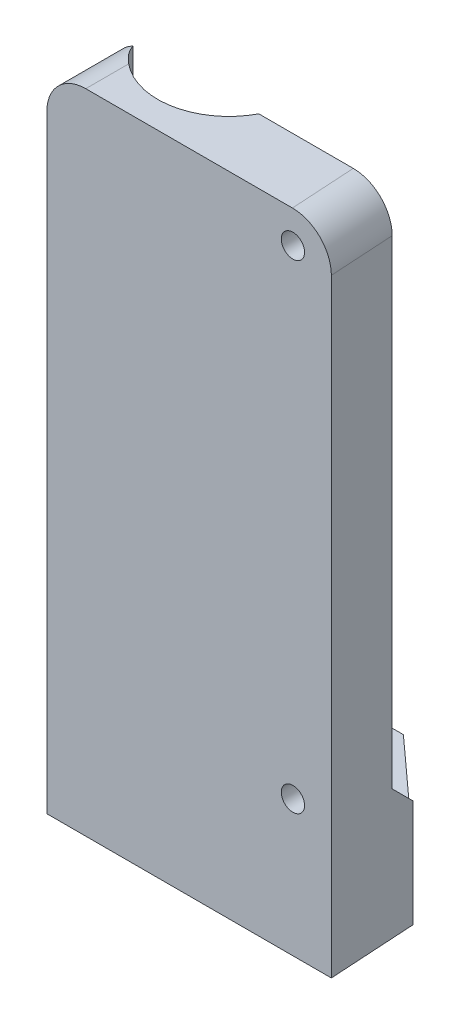
ISO-10303-21;
HEADER;
FILE_DESCRIPTION(('STEP AP214'),'2;1');
FILE_NAME('part.step','',(''),(''),'','','');
FILE_SCHEMA(('AUTOMOTIVE_DESIGN { 1 0 10303 214 1 1 1 1 }'));
ENDSEC;
DATA;
#1=APPLICATION_CONTEXT('core data for automotive mechanical design processes');
#2=APPLICATION_PROTOCOL_DEFINITION('international standard','automotive_design',2000,#1);
#3=PRODUCT_CONTEXT('',#1,'mechanical');
#4=PRODUCT('Part','Part','',(#3));
#5=PRODUCT_RELATED_PRODUCT_CATEGORY('part','',(#4));
#6=PRODUCT_DEFINITION_FORMATION('','',#4);
#7=PRODUCT_DEFINITION_CONTEXT('part definition',#1,'design');
#8=PRODUCT_DEFINITION('design','',#6,#7);
#9=PRODUCT_DEFINITION_SHAPE('','',#8);
#10=(LENGTH_UNIT() NAMED_UNIT(*) SI_UNIT(.MILLI.,.METRE.));
#11=(NAMED_UNIT(*) PLANE_ANGLE_UNIT() SI_UNIT($,.RADIAN.));
#12=(NAMED_UNIT(*) SI_UNIT($,.STERADIAN.) SOLID_ANGLE_UNIT());
#13=UNCERTAINTY_MEASURE_WITH_UNIT(LENGTH_MEASURE(1.E-05),#10,'distance_accuracy_value','');
#14=(GEOMETRIC_REPRESENTATION_CONTEXT(3) GLOBAL_UNCERTAINTY_ASSIGNED_CONTEXT((#13)) GLOBAL_UNIT_ASSIGNED_CONTEXT((#10,
#11,#12)) REPRESENTATION_CONTEXT('',''));
#15=CARTESIAN_POINT('',(0.,0.,0.));
#16=DIRECTION('',(0.,0.,1.));
#17=DIRECTION('',(1.,0.,0.));
#18=AXIS2_PLACEMENT_3D('',#15,#16,#17);
#19=CARTESIAN_POINT('',(-22.4690156650757,50.,7.56));
#20=DIRECTION('',(0.,0.,-1.));
#21=DIRECTION('',(-1.,0.,0.));
#22=AXIS2_PLACEMENT_3D('',#19,#20,#21);
#23=PLANE('',#22);
#24=CARTESIAN_POINT('',(12.5,47.5,7.56));
#25=DIRECTION('',(0.,0.,1.));
#26=DIRECTION('',(1.,0.,0.));
#27=AXIS2_PLACEMENT_3D('',#24,#25,#26);
#28=CIRCLE('',#27,0.9);
#29=CARTESIAN_POINT('',(13.4,47.5,7.56));
#30=VERTEX_POINT('',#29);
#31=EDGE_CURVE('E175',#30,#30,#28,.T.);
#32=ORIENTED_EDGE('',*,*,#31,.F.);
#33=EDGE_LOOP('',(#32));
#34=FACE_BOUND('',#33,.T.);
#35=CARTESIAN_POINT('',(12.5,10.5,7.56));
#36=DIRECTION('',(0.,0.,1.));
#37=DIRECTION('',(1.,0.,0.));
#38=AXIS2_PLACEMENT_3D('',#35,#36,#37);
#39=CIRCLE('',#38,0.9);
#40=CARTESIAN_POINT('',(13.4,10.5,7.56));
#41=VERTEX_POINT('',#40);
#42=EDGE_CURVE('E358',#41,#41,#39,.T.);
#43=ORIENTED_EDGE('',*,*,#42,.F.);
#44=EDGE_LOOP('',(#43));
#45=FACE_BOUND('',#44,.T.);
#46=DIRECTION('',(0.,1.,0.));
#47=VECTOR('',#46,1.);
#48=CARTESIAN_POINT('',(15.4690156650757,50.,7.56));
#49=LINE('',#48,#47);
#50=CARTESIAN_POINT('',(15.4690156650757,0.,7.56));
#51=VERTEX_POINT('',#50);
#52=CARTESIAN_POINT('',(15.4690156650757,47.,7.56));
#53=VERTEX_POINT('',#52);
#54=EDGE_CURVE('E246',#51,#53,#49,.T.);
#55=ORIENTED_EDGE('',*,*,#54,.T.);
#56=CARTESIAN_POINT('',(12.4635531063731,47.,7.56));
#57=DIRECTION('',(0.,0.,-1.));
#58=DIRECTION('',(-1.,0.,0.));
#59=AXIS2_PLACEMENT_3D('',#56,#57,#58);
#60=ELLIPSE('',#59,3.00546255870263,3.);
#61=CARTESIAN_POINT('',(12.4635531063731,50.,7.56));
#62=VERTEX_POINT('',#61);
#63=EDGE_CURVE('E234',#53,#62,#60,.F.);
#64=ORIENTED_EDGE('',*,*,#63,.T.);
#65=DIRECTION('',(1.,0.,0.));
#66=VECTOR('',#65,1.);
#67=CARTESIAN_POINT('',(-22.4690156650757,50.,7.56));
#68=LINE('',#67,#66);
#69=CARTESIAN_POINT('',(-3.5,50.,7.56));
#70=VERTEX_POINT('',#69);
#71=EDGE_CURVE('E244',#70,#62,#68,.T.);
#72=ORIENTED_EDGE('',*,*,#71,.F.);
#73=CARTESIAN_POINT('',(-3.5,47.,7.56));
#74=DIRECTION('',(0.,0.,-1.));
#75=DIRECTION('',(-1.,0.,0.));
#76=AXIS2_PLACEMENT_3D('',#73,#74,#75);
#77=CIRCLE('',#76,3.);
#78=CARTESIAN_POINT('',(-6.5,47.,7.56));
#79=VERTEX_POINT('',#78);
#80=EDGE_CURVE('E231',#70,#79,#77,.F.);
#81=ORIENTED_EDGE('',*,*,#80,.T.);
#82=DIRECTION('',(0.,1.,0.));
#83=VECTOR('',#82,1.);
#84=CARTESIAN_POINT('',(-6.5,50.,7.56));
#85=LINE('',#84,#83);
#86=CARTESIAN_POINT('',(-6.5,0.,7.56));
#87=VERTEX_POINT('',#86);
#88=EDGE_CURVE('E319',#87,#79,#85,.T.);
#89=ORIENTED_EDGE('',*,*,#88,.F.);
#90=DIRECTION('',(1.,0.,0.));
#91=VECTOR('',#90,1.);
#92=CARTESIAN_POINT('',(-22.4690156650757,0.,7.56));
#93=LINE('',#92,#91);
#94=EDGE_CURVE('E298',#87,#51,#93,.T.);
#95=ORIENTED_EDGE('',*,*,#94,.T.);
#96=EDGE_LOOP('',(#55,#64,#72,#81,#89,#95));
#97=FACE_BOUND('',#96,.T.);
#98=ADVANCED_FACE('F40',(#34,#45,#97),#23,.F.);
#99=CARTESIAN_POINT('',(5.32075950932338,50.,-8.));
#100=DIRECTION('',(-0.671979137980559,0.,0.740570076440376));
#101=DIRECTION('',(0.740570076440376,0.,0.671979137980559));
#102=AXIS2_PLACEMENT_3D('',#99,#100,#101);
#103=PLANE('',#102);
#104=DIRECTION('',(0.,-1.,0.));
#105=VECTOR('',#104,1.);
#106=CARTESIAN_POINT('',(6.97386903590619,50.,-6.5));
#107=LINE('',#106,#105);
#108=CARTESIAN_POINT('',(6.97386903590619,5.,-6.5));
#109=VERTEX_POINT('',#108);
#110=CARTESIAN_POINT('',(6.97386903590619,0.,-6.5));
#111=VERTEX_POINT('',#110);
#112=EDGE_CURVE('E313',#109,#111,#107,.T.);
#113=ORIENTED_EDGE('',*,*,#112,.F.);
#114=DIRECTION('',(0.740570076440376,0.,0.671979137980559));
#115=VECTOR('',#114,1.);
#116=CARTESIAN_POINT('',(5.32075950932338,5.,-8.));
#117=LINE('',#116,#115);
#118=CARTESIAN_POINT('',(11.4482854878569,5.,-2.44000000000004));
#119=VERTEX_POINT('',#118);
#120=EDGE_CURVE('E267',#109,#119,#117,.T.);
#121=ORIENTED_EDGE('',*,*,#120,.T.);
#122=DIRECTION('',(-0.614680262385864,-0.557749125966702,-0.557749125966707));
#123=VECTOR('',#122,1.);
#124=CARTESIAN_POINT('',(22.6546173963513,15.1684114648404,7.7284114648404));
#125=LINE('',#124,#123);
#126=CARTESIAN_POINT('',(15.0633149006719,8.2802086201944,0.840208620194387));
#127=VERTEX_POINT('',#126);
#128=EDGE_CURVE('E195',#119,#127,#125,.F.);
#129=ORIENTED_EDGE('',*,*,#128,.T.);
#130=DIRECTION('',(0.,-1.,0.));
#131=VECTOR('',#130,1.);
#132=CARTESIAN_POINT('',(15.0633149006719,50.,0.840208620194387));
#133=LINE('',#132,#131);
#134=CARTESIAN_POINT('',(15.0633149006719,0.,0.840208620194387));
#135=VERTEX_POINT('',#134);
#136=EDGE_CURVE('E256',#127,#135,#133,.T.);
#137=ORIENTED_EDGE('',*,*,#136,.T.);
#138=DIRECTION('',(-0.740570076440376,0.,-0.671979137980559));
#139=VECTOR('',#138,1.);
#140=CARTESIAN_POINT('',(5.32075950932338,0.,-8.));
#141=LINE('',#140,#139);
#142=EDGE_CURVE('E257',#135,#111,#141,.T.);
#143=ORIENTED_EDGE('',*,*,#142,.T.);
#144=EDGE_LOOP('',(#113,#121,#129,#137,#143));
#145=FACE_BOUND('',#144,.T.);
#146=ADVANCED_FACE('F371',(#145),#103,.F.);
#147=CARTESIAN_POINT('',(0.,50.,0.));
#148=DIRECTION('',(0.,-1.,0.));
#149=DIRECTION('',(0.,0.,-1.));
#150=AXIS2_PLACEMENT_3D('',#147,#148,#149);
#151=PLANE('',#150);
#152=ORIENTED_EDGE('',*,*,#71,.T.);
#153=DIRECTION('',(0.0602642794633902,0.,0.998182456578334));
#154=VECTOR('',#153,1.);
#155=CARTESIAN_POINT('',(12.1725982360834,50.,2.74079283839017));
#156=LINE('',#155,#154);
#157=CARTESIAN_POINT('',(12.1616830471157,50.,2.56));
#158=VERTEX_POINT('',#157);
#159=EDGE_CURVE('E221',#62,#158,#156,.F.);
#160=ORIENTED_EDGE('',*,*,#159,.T.);
#161=DIRECTION('',(1.,0.,0.));
#162=VECTOR('',#161,1.);
#163=CARTESIAN_POINT('',(4.86789482219984,50.,2.56));
#164=LINE('',#163,#162);
#165=CARTESIAN_POINT('',(4.86789482219984,50.,2.56));
#166=VERTEX_POINT('',#165);
#167=EDGE_CURVE('E217',#166,#158,#164,.T.);
#168=ORIENTED_EDGE('',*,*,#167,.F.);
#169=CARTESIAN_POINT('',(0.,50.,0.));
#170=DIRECTION('',(0.,1.,0.));
#171=DIRECTION('',(0.,0.,1.));
#172=AXIS2_PLACEMENT_3D('',#169,#170,#171);
#173=CIRCLE('',#172,5.5);
#174=CARTESIAN_POINT('',(-3.5,50.,4.24264068711928));
#175=VERTEX_POINT('',#174);
#176=EDGE_CURVE('E288',#175,#166,#173,.T.);
#177=ORIENTED_EDGE('',*,*,#176,.F.);
#178=DIRECTION('',(0.,0.,1.));
#179=VECTOR('',#178,1.);
#180=CARTESIAN_POINT('',(-3.5,50.,7.56));
#181=LINE('',#180,#179);
#182=EDGE_CURVE('E163',#175,#70,#181,.T.);
#183=ORIENTED_EDGE('',*,*,#182,.T.);
#184=EDGE_LOOP('',(#152,#160,#168,#177,#183));
#185=FACE_BOUND('',#184,.T.);
#186=ADVANCED_FACE('F251',(#185),#151,.F.);
#187=CARTESIAN_POINT('',(0.,0.,0.));
#188=DIRECTION('',(0.,-1.,0.));
#189=DIRECTION('',(0.,0.,-1.));
#190=AXIS2_PLACEMENT_3D('',#187,#188,#189);
#191=PLANE('',#190);
#192=ORIENTED_EDGE('',*,*,#94,.F.);
#193=DIRECTION('',(0.,0.,-1.));
#194=VECTOR('',#193,1.);
#195=CARTESIAN_POINT('',(-6.5,0.,0.));
#196=LINE('',#195,#194);
#197=CARTESIAN_POINT('',(-6.5,0.,0.));
#198=VERTEX_POINT('',#197);
#199=EDGE_CURVE('E284',#87,#198,#196,.T.);
#200=ORIENTED_EDGE('',*,*,#199,.T.);
#201=CARTESIAN_POINT('',(0.,0.,0.));
#202=DIRECTION('',(0.,-1.,0.));
#203=DIRECTION('',(0.,0.,-1.));
#204=AXIS2_PLACEMENT_3D('',#201,#202,#203);
#205=CIRCLE('',#204,6.50000000000001);
#206=CARTESIAN_POINT('',(0.,0.,-6.5));
#207=VERTEX_POINT('',#206);
#208=EDGE_CURVE('E322',#207,#198,#205,.F.);
#209=ORIENTED_EDGE('',*,*,#208,.F.);
#210=DIRECTION('',(1.,0.,0.));
#211=VECTOR('',#210,1.);
#212=CARTESIAN_POINT('',(0.,0.,-6.5));
#213=LINE('',#212,#211);
#214=EDGE_CURVE('E279',#207,#111,#213,.T.);
#215=ORIENTED_EDGE('',*,*,#214,.T.);
#216=ORIENTED_EDGE('',*,*,#142,.F.);
#217=DIRECTION('',(-0.0602642794633902,0.,-0.998182456578334));
#218=VECTOR('',#217,1.);
#219=CARTESIAN_POINT('',(14.9580656674088,0.,-0.903078433879208));
#220=LINE('',#219,#218);
#221=EDGE_CURVE('E307',#135,#51,#220,.F.);
#222=ORIENTED_EDGE('',*,*,#221,.T.);
#223=EDGE_LOOP('',(#192,#200,#209,#215,#216,#222));
#224=FACE_BOUND('',#223,.T.);
#225=CARTESIAN_POINT('',(0.,0.,0.));
#226=DIRECTION('',(0.,1.,0.));
#227=DIRECTION('',(0.,0.,1.));
#228=AXIS2_PLACEMENT_3D('',#225,#226,#227);
#229=CIRCLE('',#228,3.25);
#230=CARTESIAN_POINT('',(0.,0.,3.25));
#231=VERTEX_POINT('',#230);
#232=EDGE_CURVE('E295',#231,#231,#229,.T.);
#233=ORIENTED_EDGE('',*,*,#232,.T.);
#234=EDGE_LOOP('',(#233));
#235=FACE_BOUND('',#234,.T.);
#236=ADVANCED_FACE('F408',(#224,#235),#191,.T.);
#237=CARTESIAN_POINT('',(0.,50.,0.));
#238=DIRECTION('',(0.,-1.,0.));
#239=DIRECTION('',(0.,0.,-1.));
#240=AXIS2_PLACEMENT_3D('',#237,#238,#239);
#241=CYLINDRICAL_SURFACE('',#240,3.25);
#242=CARTESIAN_POINT('',(0.,5.,0.));
#243=DIRECTION('',(0.,-1.,0.));
#244=DIRECTION('',(0.,0.,-1.));
#245=AXIS2_PLACEMENT_3D('',#242,#243,#244);
#246=CIRCLE('',#245,3.25);
#247=CARTESIAN_POINT('',(0.,5.,-3.25));
#248=VERTEX_POINT('',#247);
#249=EDGE_CURVE('E294',#248,#248,#246,.T.);
#250=ORIENTED_EDGE('',*,*,#249,.F.);
#251=EDGE_LOOP('',(#250));
#252=FACE_BOUND('',#251,.T.);
#253=ORIENTED_EDGE('',*,*,#232,.F.);
#254=EDGE_LOOP('',(#253));
#255=FACE_BOUND('',#254,.T.);
#256=ADVANCED_FACE('F405',(#252,#255),#241,.F.);
#257=CARTESIAN_POINT('',(15.0633149006719,50.,0.840208620194387));
#258=DIRECTION('',(-0.998182456578334,0.,0.0602642794633902));
#259=DIRECTION('',(0.,-1.,0.));
#260=AXIS2_PLACEMENT_3D('',#257,#258,#259);
#261=PLANE('',#260);
#262=DIRECTION('',(0.,1.,0.));
#263=VECTOR('',#262,1.);
#264=CARTESIAN_POINT('',(15.1671456058184,50.,2.56));
#265=LINE('',#264,#263);
#266=CARTESIAN_POINT('',(15.1671456058184,47.,2.56));
#267=VERTEX_POINT('',#266);
#268=CARTESIAN_POINT('',(15.1671456058184,9.99999999999999,2.56));
#269=VERTEX_POINT('',#268);
#270=EDGE_CURVE('E261',#267,#269,#265,.F.);
#271=ORIENTED_EDGE('',*,*,#270,.F.);
#272=DIRECTION('',(-0.0602642794633902,0.,-0.998182456578334));
#273=VECTOR('',#272,1.);
#274=CARTESIAN_POINT('',(15.4690156650757,47.,7.56));
#275=LINE('',#274,#273);
#276=EDGE_CURVE('E228',#267,#53,#275,.F.);
#277=ORIENTED_EDGE('',*,*,#276,.T.);
#278=ORIENTED_EDGE('',*,*,#54,.F.);
#279=ORIENTED_EDGE('',*,*,#221,.F.);
#280=ORIENTED_EDGE('',*,*,#136,.F.);
#281=DIRECTION('',(0.0426520239962568,0.706463305787715,0.706463305787722));
#282=VECTOR('',#281,1.);
#283=CARTESIAN_POINT('',(14.8382327093688,4.55207818127485,-2.8879218187252));
#284=LINE('',#283,#282);
#285=EDGE_CURVE('E199',#127,#269,#284,.T.);
#286=ORIENTED_EDGE('',*,*,#285,.T.);
#287=EDGE_LOOP('',(#271,#277,#278,#279,#280,#286));
#288=FACE_BOUND('',#287,.T.);
#289=ADVANCED_FACE('F263',(#288),#261,.F.);
#290=CARTESIAN_POINT('',(0.,5.,0.));
#291=DIRECTION('',(0.,-1.,0.));
#292=DIRECTION('',(0.,0.,-1.));
#293=AXIS2_PLACEMENT_3D('',#290,#291,#292);
#294=PLANE('',#293);
#295=ORIENTED_EDGE('',*,*,#249,.T.);
#296=EDGE_LOOP('',(#295));
#297=FACE_BOUND('',#296,.T.);
#298=CARTESIAN_POINT('',(0.,5.,0.));
#299=DIRECTION('',(0.,-1.,0.));
#300=DIRECTION('',(0.,0.,-1.));
#301=AXIS2_PLACEMENT_3D('',#298,#299,#300);
#302=CIRCLE('',#301,5.5);
#303=CARTESIAN_POINT('',(-4.92913785564979,5.,-2.44000000000004));
#304=VERTEX_POINT('',#303);
#305=CARTESIAN_POINT('',(4.92913785564979,5.,-2.44000000000004));
#306=VERTEX_POINT('',#305);
#307=EDGE_CURVE('E291',#304,#306,#302,.F.);
#308=ORIENTED_EDGE('',*,*,#307,.T.);
#309=DIRECTION('',(1.,0.,0.));
#310=VECTOR('',#309,1.);
#311=CARTESIAN_POINT('',(15.1671456058184,5.,-2.44000000000004));
#312=LINE('',#311,#310);
#313=EDGE_CURVE('E183',#306,#119,#312,.T.);
#314=ORIENTED_EDGE('',*,*,#313,.T.);
#315=ORIENTED_EDGE('',*,*,#120,.F.);
#316=DIRECTION('',(-1.,0.,0.));
#317=VECTOR('',#316,1.);
#318=CARTESIAN_POINT('',(0.,5.,-6.5));
#319=LINE('',#318,#317);
#320=CARTESIAN_POINT('',(0.,5.,-6.5));
#321=VERTEX_POINT('',#320);
#322=EDGE_CURVE('E274',#109,#321,#319,.T.);
#323=ORIENTED_EDGE('',*,*,#322,.T.);
#324=CARTESIAN_POINT('',(0.,5.,0.));
#325=DIRECTION('',(0.,-1.,0.));
#326=DIRECTION('',(0.,0.,-1.));
#327=AXIS2_PLACEMENT_3D('',#324,#325,#326);
#328=CIRCLE('',#327,6.50000000000001);
#329=CARTESIAN_POINT('',(-6.02464936739058,5.,-2.44000000000004));
#330=VERTEX_POINT('',#329);
#331=EDGE_CURVE('E326',#330,#321,#328,.T.);
#332=ORIENTED_EDGE('',*,*,#331,.F.);
#333=DIRECTION('',(1.,0.,0.));
#334=VECTOR('',#333,1.);
#335=CARTESIAN_POINT('',(-4.86789482219984,5.,-2.44000000000004));
#336=LINE('',#335,#334);
#337=EDGE_CURVE('E189',#330,#304,#336,.T.);
#338=ORIENTED_EDGE('',*,*,#337,.T.);
#339=EDGE_LOOP('',(#308,#314,#315,#323,#332,#338));
#340=FACE_BOUND('',#339,.T.);
#341=ADVANCED_FACE('F336',(#297,#340),#294,.F.);
#342=CARTESIAN_POINT('',(0.,-15.556349186104,0.));
#343=DIRECTION('',(0.,1.,0.));
#344=DIRECTION('',(0.,0.,1.));
#345=AXIS2_PLACEMENT_3D('',#342,#343,#344);
#346=CYLINDRICAL_SURFACE('',#345,5.5);
#347=DIRECTION('',(0.,1.,0.));
#348=VECTOR('',#347,1.);
#349=CARTESIAN_POINT('',(-4.86789482219984,-27.0000526923064,2.56));
#350=LINE('',#349,#348);
#351=CARTESIAN_POINT('',(-4.86789482219984,9.99999999999998,2.56));
#352=VERTEX_POINT('',#351);
#353=CARTESIAN_POINT('',(-4.86789482219984,49.6699932126129,2.56));
#354=VERTEX_POINT('',#353);
#355=EDGE_CURVE('E346',#352,#354,#350,.T.);
#356=ORIENTED_EDGE('',*,*,#355,.T.);
#357=CARTESIAN_POINT('',(-4.86789482219984,49.6699932126129,2.56));
#358=CARTESIAN_POINT('',(-4.81001281115621,49.6996372383301,2.67001908267944));
#359=CARTESIAN_POINT('',(-4.74841065562674,49.7288291876159,2.77813710862384));
#360=CARTESIAN_POINT('',(-4.61761712121786,49.7849637569741,2.99053032643147));
#361=CARTESIAN_POINT('',(-4.54841390009771,49.8119027486319,3.09479917385239));
#362=CARTESIAN_POINT('',(-4.33241325172603,49.886162664514,3.39713838700284));
#363=CARTESIAN_POINT('',(-4.17488566536807,49.9282331416977,3.5891975536215));
#364=CARTESIAN_POINT('',(-3.92577605461678,49.9706944341158,3.85374625409529));
#365=CARTESIAN_POINT('',(-3.84468799903182,49.9813183072902,3.93465582456891));
#366=CARTESIAN_POINT('',(-3.67658093890007,49.995995389604,4.09220625191814));
#367=CARTESIAN_POINT('',(-3.58951647701177,49.999990636361,4.1688038524149));
#368=CARTESIAN_POINT('',(-3.5,50.,4.24264068711928));
#369=B_SPLINE_CURVE_WITH_KNOTS('',3,(#357,#358,#359,#360,#361,#362,#363,#364,#365,#366,#367,
#368),.UNSPECIFIED.,.F.,.F.,(4,2,2,2,2,4),(0.,0.383207720744879,0.767021171471671,
1.51917460073373,1.8639442741787,2.2117131112596),.UNSPECIFIED.);
#370=EDGE_CURVE('E12',#354,#175,#369,.T.);
#371=ORIENTED_EDGE('',*,*,#370,.T.);
#372=ORIENTED_EDGE('',*,*,#176,.T.);
#373=DIRECTION('',(0.,1.,0.));
#374=VECTOR('',#373,1.);
#375=CARTESIAN_POINT('',(4.86789482219984,-27.0000526923064,2.56));
#376=LINE('',#375,#374);
#377=CARTESIAN_POINT('',(4.86789482219984,9.99999999999998,2.56));
#378=VERTEX_POINT('',#377);
#379=EDGE_CURVE('E350',#378,#166,#376,.T.);
#380=ORIENTED_EDGE('',*,*,#379,.F.);
#381=CARTESIAN_POINT('',(0.,7.44000000000002,0.));
#382=DIRECTION('',(0.,0.707106781186551,-0.707106781186544));
#383=DIRECTION('',(0.,0.707106781186544,0.707106781186551));
#384=AXIS2_PLACEMENT_3D('',#381,#382,#383);
#385=ELLIPSE('',#384,7.77817459305199,5.5);
#386=EDGE_CURVE('E181',#378,#306,#385,.T.);
#387=ORIENTED_EDGE('',*,*,#386,.T.);
#388=ORIENTED_EDGE('',*,*,#307,.F.);
#389=CARTESIAN_POINT('',(0.,7.44000000000002,0.));
#390=DIRECTION('',(0.,0.70710678118655,-0.707106781186545));
#391=DIRECTION('',(0.,0.707106781186545,0.70710678118655));
#392=AXIS2_PLACEMENT_3D('',#389,#390,#391);
#393=ELLIPSE('',#392,7.77817459305199,5.5);
#394=EDGE_CURVE('E205',#304,#352,#393,.T.);
#395=ORIENTED_EDGE('',*,*,#394,.T.);
#396=EDGE_LOOP('',(#356,#371,#372,#380,#387,#388,#395));
#397=FACE_BOUND('',#396,.T.);
#398=ADVANCED_FACE('F345',(#397),#346,.F.);
#399=CARTESIAN_POINT('',(-6.5,-1.2E-05,0.));
#400=DIRECTION('',(-1.,0.,0.));
#401=DIRECTION('',(0.,0.,1.));
#402=AXIS2_PLACEMENT_3D('',#399,#400,#401);
#403=PLANE('',#402);
#404=ORIENTED_EDGE('',*,*,#88,.T.);
#405=DIRECTION('',(0.,0.,1.));
#406=VECTOR('',#405,1.);
#407=CARTESIAN_POINT('',(-6.5,47.,2.56));
#408=LINE('',#407,#406);
#409=CARTESIAN_POINT('',(-6.5,47.,2.56));
#410=VERTEX_POINT('',#409);
#411=EDGE_CURVE('E69',#79,#410,#408,.F.);
#412=ORIENTED_EDGE('',*,*,#411,.T.);
#413=DIRECTION('',(0.,1.,0.));
#414=VECTOR('',#413,1.);
#415=CARTESIAN_POINT('',(-6.5,-1.2E-05,2.56));
#416=LINE('',#415,#414);
#417=CARTESIAN_POINT('',(-6.5,9.99999999999999,2.56));
#418=VERTEX_POINT('',#417);
#419=EDGE_CURVE('E329',#418,#410,#416,.T.);
#420=ORIENTED_EDGE('',*,*,#419,.F.);
#421=DIRECTION('',(0.,0.707106781186545,0.70710678118655));
#422=VECTOR('',#421,1.);
#423=CARTESIAN_POINT('',(-6.5,5.,-2.44000000000004));
#424=LINE('',#423,#422);
#425=CARTESIAN_POINT('',(-6.5,7.44000000000003,0.));
#426=VERTEX_POINT('',#425);
#427=EDGE_CURVE('E208',#418,#426,#424,.F.);
#428=ORIENTED_EDGE('',*,*,#427,.T.);
#429=DIRECTION('',(0.,-1.,0.));
#430=VECTOR('',#429,1.);
#431=CARTESIAN_POINT('',(-6.5,50.,0.));
#432=LINE('',#431,#430);
#433=EDGE_CURVE('E266',#426,#198,#432,.T.);
#434=ORIENTED_EDGE('',*,*,#433,.T.);
#435=ORIENTED_EDGE('',*,*,#199,.F.);
#436=EDGE_LOOP('',(#404,#412,#420,#428,#434,#435));
#437=FACE_BOUND('',#436,.T.);
#438=ADVANCED_FACE('F396',(#437),#403,.T.);
#439=CARTESIAN_POINT('',(0.,-1.2E-05,-6.5));
#440=DIRECTION('',(0.,0.,-1.));
#441=DIRECTION('',(-1.,0.,0.));
#442=AXIS2_PLACEMENT_3D('',#439,#440,#441);
#443=PLANE('',#442);
#444=ORIENTED_EDGE('',*,*,#322,.F.);
#445=ORIENTED_EDGE('',*,*,#112,.T.);
#446=ORIENTED_EDGE('',*,*,#214,.F.);
#447=DIRECTION('',(0.,-1.,0.));
#448=VECTOR('',#447,1.);
#449=CARTESIAN_POINT('',(0.,50.,-6.5));
#450=LINE('',#449,#448);
#451=EDGE_CURVE('E271',#321,#207,#450,.T.);
#452=ORIENTED_EDGE('',*,*,#451,.F.);
#453=EDGE_LOOP('',(#444,#445,#446,#452));
#454=FACE_BOUND('',#453,.T.);
#455=ADVANCED_FACE('F392',(#454),#443,.T.);
#456=CARTESIAN_POINT('',(0.,50.,0.));
#457=DIRECTION('',(0.,-1.,0.));
#458=DIRECTION('',(0.,0.,-1.));
#459=AXIS2_PLACEMENT_3D('',#456,#457,#458);
#460=CYLINDRICAL_SURFACE('',#459,6.50000000000001);
#461=ORIENTED_EDGE('',*,*,#433,.F.);
#462=CARTESIAN_POINT('',(0.,7.44000000000002,0.));
#463=DIRECTION('',(0.,0.70710678118655,-0.707106781186545));
#464=DIRECTION('',(0.,-0.707106781186545,-0.70710678118655));
#465=AXIS2_PLACEMENT_3D('',#462,#463,#464);
#466=ELLIPSE('',#465,9.19238815542509,6.50000000000001);
#467=EDGE_CURVE('E164',#426,#330,#466,.F.);
#468=ORIENTED_EDGE('',*,*,#467,.T.);
#469=ORIENTED_EDGE('',*,*,#331,.T.);
#470=ORIENTED_EDGE('',*,*,#451,.T.);
#471=ORIENTED_EDGE('',*,*,#208,.T.);
#472=EDGE_LOOP('',(#461,#468,#469,#470,#471));
#473=FACE_BOUND('',#472,.T.);
#474=ADVANCED_FACE('F388',(#473),#460,.T.);
#475=CARTESIAN_POINT('',(4.86789482219984,-27.0000526923064,2.56));
#476=DIRECTION('',(0.,0.,1.));
#477=DIRECTION('',(1.,0.,0.));
#478=AXIS2_PLACEMENT_3D('',#475,#476,#477);
#479=PLANE('',#478);
#480=CARTESIAN_POINT('',(12.5,47.5,2.56));
#481=DIRECTION('',(0.,0.,1.));
#482=DIRECTION('',(1.,0.,0.));
#483=AXIS2_PLACEMENT_3D('',#480,#481,#482);
#484=CIRCLE('',#483,0.9);
#485=CARTESIAN_POINT('',(13.4,47.5,2.56));
#486=VERTEX_POINT('',#485);
#487=EDGE_CURVE('E174',#486,#486,#484,.T.);
#488=ORIENTED_EDGE('',*,*,#487,.T.);
#489=EDGE_LOOP('',(#488));
#490=FACE_BOUND('',#489,.T.);
#491=ORIENTED_EDGE('',*,*,#167,.T.);
#492=CARTESIAN_POINT('',(12.1616830471157,47.,2.56));
#493=DIRECTION('',(0.,0.,1.));
#494=DIRECTION('',(-1.,0.,0.));
#495=AXIS2_PLACEMENT_3D('',#492,#493,#494);
#496=ELLIPSE('',#495,3.00546255870263,3.);
#497=EDGE_CURVE('E225',#158,#267,#496,.F.);
#498=ORIENTED_EDGE('',*,*,#497,.T.);
#499=ORIENTED_EDGE('',*,*,#270,.T.);
#500=DIRECTION('',(-1.,0.,0.));
#501=VECTOR('',#500,1.);
#502=CARTESIAN_POINT('',(4.86789482219984,9.99999999999999,2.56));
#503=LINE('',#502,#501);
#504=CARTESIAN_POINT('',(13.2483314773548,9.99999999999999,2.56));
#505=VERTEX_POINT('',#504);
#506=EDGE_CURVE('E172',#269,#505,#503,.T.);
#507=ORIENTED_EDGE('',*,*,#506,.T.);
#508=CARTESIAN_POINT('',(12.5,10.5,2.56));
#509=DIRECTION('',(0.,0.,1.));
#510=DIRECTION('',(1.,0.,0.));
#511=AXIS2_PLACEMENT_3D('',#508,#509,#510);
#512=CIRCLE('',#511,0.9);
#513=CARTESIAN_POINT('',(11.7516685226452,9.99999999999999,2.56));
#514=VERTEX_POINT('',#513);
#515=EDGE_CURVE('E157',#505,#514,#512,.T.);
#516=ORIENTED_EDGE('',*,*,#515,.T.);
#517=EDGE_CURVE('E170',#514,#378,#503,.T.);
#518=ORIENTED_EDGE('',*,*,#517,.T.);
#519=ORIENTED_EDGE('',*,*,#379,.T.);
#520=EDGE_LOOP('',(#491,#498,#499,#507,#516,#518,#519));
#521=FACE_BOUND('',#520,.T.);
#522=ADVANCED_FACE('F168',(#490,#521),#479,.F.);
#523=CARTESIAN_POINT('',(-4.86789482219984,-27.0000526923064,2.56));
#524=DIRECTION('',(0.,0.,1.));
#525=DIRECTION('',(1.,0.,0.));
#526=AXIS2_PLACEMENT_3D('',#523,#524,#525);
#527=PLANE('',#526);
#528=ORIENTED_EDGE('',*,*,#419,.T.);
#529=CARTESIAN_POINT('',(-3.5,47.,2.56));
#530=DIRECTION('',(0.,0.,1.));
#531=DIRECTION('',(1.,0.,0.));
#532=AXIS2_PLACEMENT_3D('',#529,#530,#531);
#533=CIRCLE('',#532,3.);
#534=EDGE_CURVE('E55',#410,#354,#533,.F.);
#535=ORIENTED_EDGE('',*,*,#534,.T.);
#536=ORIENTED_EDGE('',*,*,#355,.F.);
#537=DIRECTION('',(-1.,0.,0.));
#538=VECTOR('',#537,1.);
#539=CARTESIAN_POINT('',(-6.5,9.99999999999999,2.56));
#540=LINE('',#539,#538);
#541=EDGE_CURVE('E187',#352,#418,#540,.T.);
#542=ORIENTED_EDGE('',*,*,#541,.T.);
#543=EDGE_LOOP('',(#528,#535,#536,#542));
#544=FACE_BOUND('',#543,.T.);
#545=ADVANCED_FACE('F348',(#544),#527,.F.);
#546=CARTESIAN_POINT('',(0.,5.,-2.44000000000004));
#547=DIRECTION('',(0.,0.707106781186551,-0.707106781186544));
#548=DIRECTION('',(-1.,0.,0.));
#549=AXIS2_PLACEMENT_3D('',#546,#547,#548);
#550=PLANE('',#549);
#551=ORIENTED_EDGE('',*,*,#517,.F.);
#552=CARTESIAN_POINT('',(12.5,10.5,3.06000000000002));
#553=DIRECTION('',(0.,0.707106781186551,-0.707106781186544));
#554=DIRECTION('',(0.,0.707106781186544,0.707106781186551));
#555=AXIS2_PLACEMENT_3D('',#552,#553,#554);
#556=ELLIPSE('',#555,1.27279220613579,0.9);
#557=EDGE_CURVE('E154',#514,#505,#556,.F.);
#558=ORIENTED_EDGE('',*,*,#557,.T.);
#559=ORIENTED_EDGE('',*,*,#506,.F.);
#560=ORIENTED_EDGE('',*,*,#285,.F.);
#561=ORIENTED_EDGE('',*,*,#128,.F.);
#562=ORIENTED_EDGE('',*,*,#313,.F.);
#563=ORIENTED_EDGE('',*,*,#386,.F.);
#564=EDGE_LOOP('',(#551,#558,#559,#560,#561,#562,#563));
#565=FACE_BOUND('',#564,.T.);
#566=ADVANCED_FACE('F178',(#565),#550,.T.);
#567=CARTESIAN_POINT('',(0.,5.,-2.44000000000004));
#568=DIRECTION('',(0.,0.70710678118655,-0.707106781186545));
#569=DIRECTION('',(-1.,0.,0.));
#570=AXIS2_PLACEMENT_3D('',#567,#568,#569);
#571=PLANE('',#570);
#572=ORIENTED_EDGE('',*,*,#427,.F.);
#573=ORIENTED_EDGE('',*,*,#541,.F.);
#574=ORIENTED_EDGE('',*,*,#394,.F.);
#575=ORIENTED_EDGE('',*,*,#337,.F.);
#576=ORIENTED_EDGE('',*,*,#467,.F.);
#577=EDGE_LOOP('',(#572,#573,#574,#575,#576));
#578=FACE_BOUND('',#577,.T.);
#579=ADVANCED_FACE('F342',(#578),#571,.T.);
#580=CARTESIAN_POINT('',(12.5,10.5,-2.44));
#581=DIRECTION('',(0.,0.,1.));
#582=DIRECTION('',(1.,0.,0.));
#583=AXIS2_PLACEMENT_3D('',#580,#581,#582);
#584=CYLINDRICAL_SURFACE('',#583,0.9);
#585=ORIENTED_EDGE('',*,*,#42,.T.);
#586=EDGE_LOOP('',(#585));
#587=FACE_BOUND('',#586,.T.);
#588=ORIENTED_EDGE('',*,*,#557,.F.);
#589=ORIENTED_EDGE('',*,*,#515,.F.);
#590=EDGE_LOOP('',(#588,#589));
#591=FACE_BOUND('',#590,.T.);
#592=ADVANCED_FACE('F156',(#587,#591),#584,.F.);
#593=CARTESIAN_POINT('',(12.5,47.5,-2.44));
#594=DIRECTION('',(0.,0.,1.));
#595=DIRECTION('',(1.,0.,0.));
#596=AXIS2_PLACEMENT_3D('',#593,#594,#595);
#597=CYLINDRICAL_SURFACE('',#596,0.9);
#598=ORIENTED_EDGE('',*,*,#31,.T.);
#599=EDGE_LOOP('',(#598));
#600=FACE_BOUND('',#599,.T.);
#601=ORIENTED_EDGE('',*,*,#487,.F.);
#602=EDGE_LOOP('',(#601));
#603=FACE_BOUND('',#602,.T.);
#604=ADVANCED_FACE('F366',(#600,#603),#597,.F.);
#605=CARTESIAN_POINT('',(11.9635182976738,47.,-0.722285595489038));
#606=DIRECTION('',(-0.0602642794633902,0.,-0.998182456578334));
#607=DIRECTION('',(-0.998182456578334,0.,0.0602642794633902));
#608=AXIS2_PLACEMENT_3D('',#605,#606,#607);
#609=CYLINDRICAL_SURFACE('',#608,3.);
#610=ORIENTED_EDGE('',*,*,#63,.F.);
#611=ORIENTED_EDGE('',*,*,#276,.F.);
#612=ORIENTED_EDGE('',*,*,#497,.F.);
#613=ORIENTED_EDGE('',*,*,#159,.F.);
#614=EDGE_LOOP('',(#610,#611,#612,#613));
#615=FACE_BOUND('',#614,.T.);
#616=ADVANCED_FACE('F259',(#615),#609,.T.);
#617=CARTESIAN_POINT('',(-3.5,47.,0.));
#618=DIRECTION('',(0.,0.,-1.));
#619=DIRECTION('',(-1.,0.,0.));
#620=AXIS2_PLACEMENT_3D('',#617,#618,#619);
#621=CYLINDRICAL_SURFACE('',#620,3.);
#622=ORIENTED_EDGE('',*,*,#534,.F.);
#623=ORIENTED_EDGE('',*,*,#411,.F.);
#624=ORIENTED_EDGE('',*,*,#80,.F.);
#625=ORIENTED_EDGE('',*,*,#182,.F.);
#626=ORIENTED_EDGE('',*,*,#370,.F.);
#627=EDGE_LOOP('',(#622,#623,#624,#625,#626));
#628=FACE_BOUND('',#627,.T.);
#629=ADVANCED_FACE('F42',(#628),#621,.T.);
#630=CLOSED_SHELL('',(#98,#146,#186,#236,#256,#289,#341,#398,#438,#455,#474,#522,#545,#566,#579,
#592,#604,#616,#629));
#631=MANIFOLD_SOLID_BREP('B2',#630);
#632=ADVANCED_BREP_SHAPE_REPRESENTATION('',(#18,#631),#14);
#633=SHAPE_DEFINITION_REPRESENTATION(#9,#632);
ENDSEC;
END-ISO-10303-21;
